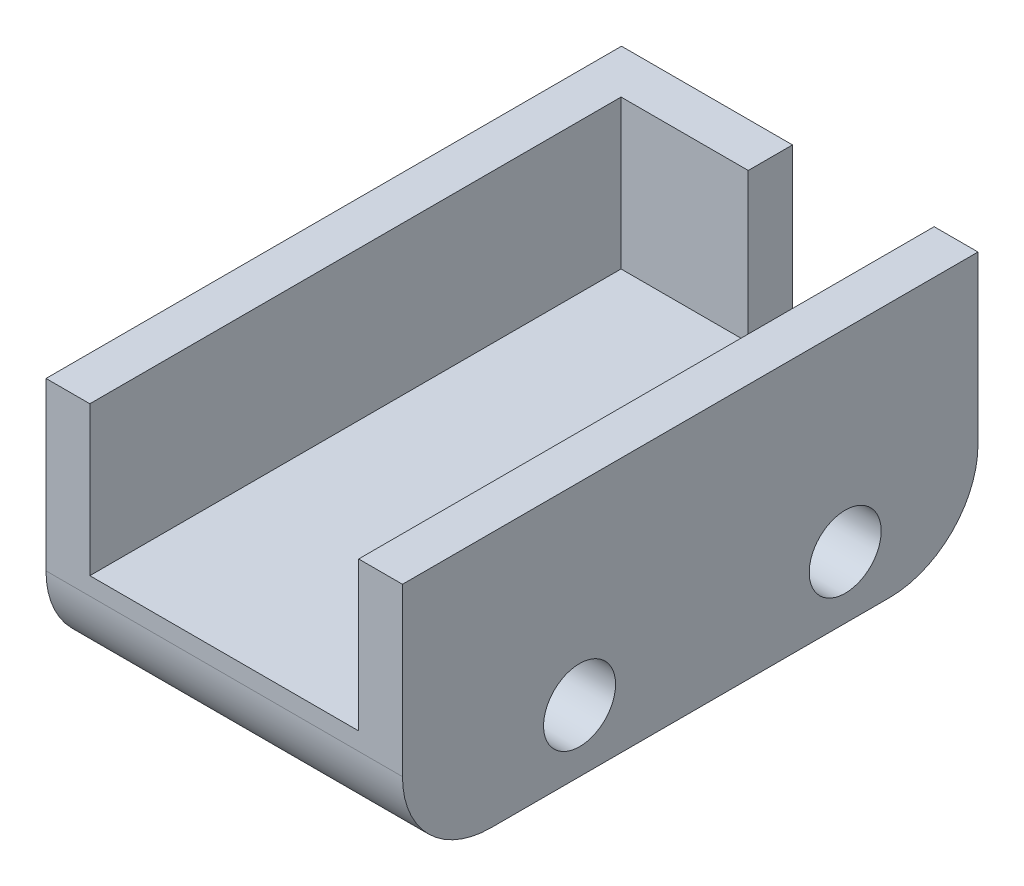
ISO-10303-21;
HEADER;
FILE_DESCRIPTION(('STEP AP214'),'2;1');
FILE_NAME('part.step','',(''),(''),'','','');
FILE_SCHEMA(('AUTOMOTIVE_DESIGN { 1 0 10303 214 1 1 1 1 }'));
ENDSEC;
DATA;
#1=APPLICATION_CONTEXT('core data for automotive mechanical design processes');
#2=APPLICATION_PROTOCOL_DEFINITION('international standard','automotive_design',2000,#1);
#3=PRODUCT_CONTEXT('',#1,'mechanical');
#4=PRODUCT('Part','Part','',(#3));
#5=PRODUCT_RELATED_PRODUCT_CATEGORY('part','',(#4));
#6=PRODUCT_DEFINITION_FORMATION('','',#4);
#7=PRODUCT_DEFINITION_CONTEXT('part definition',#1,'design');
#8=PRODUCT_DEFINITION('design','',#6,#7);
#9=PRODUCT_DEFINITION_SHAPE('','',#8);
#10=(LENGTH_UNIT() NAMED_UNIT(*) SI_UNIT(.MILLI.,.METRE.));
#11=(NAMED_UNIT(*) PLANE_ANGLE_UNIT() SI_UNIT($,.RADIAN.));
#12=(NAMED_UNIT(*) SI_UNIT($,.STERADIAN.) SOLID_ANGLE_UNIT());
#13=UNCERTAINTY_MEASURE_WITH_UNIT(LENGTH_MEASURE(1.E-05),#10,'distance_accuracy_value','');
#14=(GEOMETRIC_REPRESENTATION_CONTEXT(3) GLOBAL_UNCERTAINTY_ASSIGNED_CONTEXT((#13)) GLOBAL_UNIT_ASSIGNED_CONTEXT((#10,
#11,#12)) REPRESENTATION_CONTEXT('',''));
#15=CARTESIAN_POINT('',(0.,0.,0.));
#16=DIRECTION('',(0.,0.,1.));
#17=DIRECTION('',(1.,0.,0.));
#18=AXIS2_PLACEMENT_3D('',#15,#16,#17);
#19=CARTESIAN_POINT('',(0.,26.8179352455805,65.));
#20=DIRECTION('',(0.,1.,0.));
#21=DIRECTION('',(0.,0.,1.));
#22=AXIS2_PLACEMENT_3D('',#19,#20,#21);
#23=PLANE('',#22);
#24=DIRECTION('',(1.,0.,0.));
#25=VECTOR('',#24,1.);
#26=CARTESIAN_POINT('',(0.,26.8179352455805,0.));
#27=LINE('',#26,#25);
#28=CARTESIAN_POINT('',(35.3129848,26.8179352455805,0.));
#29=VERTEX_POINT('',#28);
#30=CARTESIAN_POINT('',(40.2629848,26.8179352455805,0.));
#31=VERTEX_POINT('',#30);
#32=EDGE_CURVE('E149',#29,#31,#27,.T.);
#33=ORIENTED_EDGE('',*,*,#32,.F.);
#34=DIRECTION('',(0.,0.,-1.));
#35=VECTOR('',#34,1.);
#36=CARTESIAN_POINT('',(35.3129848,26.8179352455805,65.));
#37=LINE('',#36,#35);
#38=CARTESIAN_POINT('',(35.3129848,26.8179352455805,65.));
#39=VERTEX_POINT('',#38);
#40=EDGE_CURVE('E131',#39,#29,#37,.T.);
#41=ORIENTED_EDGE('',*,*,#40,.F.);
#42=DIRECTION('',(1.,0.,0.));
#43=VECTOR('',#42,1.);
#44=CARTESIAN_POINT('',(0.,26.8179352455805,65.));
#45=LINE('',#44,#43);
#46=CARTESIAN_POINT('',(40.2629848,26.8179352455805,65.));
#47=VERTEX_POINT('',#46);
#48=EDGE_CURVE('E181',#39,#47,#45,.T.);
#49=ORIENTED_EDGE('',*,*,#48,.T.);
#50=DIRECTION('',(0.,0.,-1.));
#51=VECTOR('',#50,1.);
#52=CARTESIAN_POINT('',(40.2629848,26.8179352455805,65.));
#53=LINE('',#52,#51);
#54=EDGE_CURVE('E160',#47,#31,#53,.T.);
#55=ORIENTED_EDGE('',*,*,#54,.T.);
#56=EDGE_LOOP('',(#33,#41,#49,#55));
#57=FACE_BOUND('',#56,.T.);
#58=ADVANCED_FACE('F41',(#57),#23,.T.);
#59=CARTESIAN_POINT('',(0.,8.,55.));
#60=DIRECTION('',(1.,0.,0.));
#61=DIRECTION('',(0.,0.,-1.));
#62=AXIS2_PLACEMENT_3D('',#59,#60,#61);
#63=CYLINDRICAL_SURFACE('',#62,10.);
#64=DIRECTION('',(1.,0.,0.));
#65=VECTOR('',#64,1.);
#66=CARTESIAN_POINT('',(0.,8.,65.));
#67=LINE('',#66,#65);
#68=CARTESIAN_POINT('',(0.,8.,65.));
#69=VERTEX_POINT('',#68);
#70=CARTESIAN_POINT('',(40.2629848,8.,65.));
#71=VERTEX_POINT('',#70);
#72=EDGE_CURVE('E203',#69,#71,#67,.T.);
#73=ORIENTED_EDGE('',*,*,#72,.F.);
#74=CARTESIAN_POINT('',(0.,8.,55.));
#75=DIRECTION('',(-1.,0.,0.));
#76=DIRECTION('',(0.,0.,1.));
#77=AXIS2_PLACEMENT_3D('',#74,#75,#76);
#78=CIRCLE('',#77,10.);
#79=CARTESIAN_POINT('',(0.,-2.,55.));
#80=VERTEX_POINT('',#79);
#81=EDGE_CURVE('E50',#80,#69,#78,.T.);
#82=ORIENTED_EDGE('',*,*,#81,.F.);
#83=DIRECTION('',(1.,0.,0.));
#84=VECTOR('',#83,1.);
#85=CARTESIAN_POINT('',(0.,-2.,55.));
#86=LINE('',#85,#84);
#87=CARTESIAN_POINT('',(40.2629848,-2.,55.));
#88=VERTEX_POINT('',#87);
#89=EDGE_CURVE('E207',#88,#80,#86,.F.);
#90=ORIENTED_EDGE('',*,*,#89,.F.);
#91=CARTESIAN_POINT('',(40.2629848,8.,55.));
#92=DIRECTION('',(-1.,0.,0.));
#93=DIRECTION('',(0.,-1.,0.));
#94=AXIS2_PLACEMENT_3D('',#91,#92,#93);
#95=CIRCLE('',#94,10.);
#96=EDGE_CURVE('E11',#71,#88,#95,.F.);
#97=ORIENTED_EDGE('',*,*,#96,.F.);
#98=EDGE_LOOP('',(#73,#82,#90,#97));
#99=FACE_BOUND('',#98,.T.);
#100=ADVANCED_FACE('F43',(#99),#63,.T.);
#101=CARTESIAN_POINT('',(0.,8.,10.));
#102=DIRECTION('',(1.,0.,0.));
#103=DIRECTION('',(0.,0.,-1.));
#104=AXIS2_PLACEMENT_3D('',#101,#102,#103);
#105=CYLINDRICAL_SURFACE('',#104,10.);
#106=DIRECTION('',(-1.,0.,0.));
#107=VECTOR('',#106,1.);
#108=CARTESIAN_POINT('',(0.,8.,0.));
#109=LINE('',#108,#107);
#110=CARTESIAN_POINT('',(40.2629848,8.,0.));
#111=VERTEX_POINT('',#110);
#112=CARTESIAN_POINT('',(0.,8.,0.));
#113=VERTEX_POINT('',#112);
#114=EDGE_CURVE('E186',#111,#113,#109,.T.);
#115=ORIENTED_EDGE('',*,*,#114,.F.);
#116=CARTESIAN_POINT('',(40.2629848,8.,10.));
#117=DIRECTION('',(-1.,0.,0.));
#118=DIRECTION('',(0.,-1.,0.));
#119=AXIS2_PLACEMENT_3D('',#116,#117,#118);
#120=CIRCLE('',#119,10.);
#121=CARTESIAN_POINT('',(40.2629848,-2.,9.99999999999999));
#122=VERTEX_POINT('',#121);
#123=EDGE_CURVE('E196',#122,#111,#120,.F.);
#124=ORIENTED_EDGE('',*,*,#123,.F.);
#125=DIRECTION('',(-1.,0.,0.));
#126=VECTOR('',#125,1.);
#127=CARTESIAN_POINT('',(0.,-2.,10.));
#128=LINE('',#127,#126);
#129=CARTESIAN_POINT('',(0.,-2.,9.99999999999999));
#130=VERTEX_POINT('',#129);
#131=EDGE_CURVE('E192',#130,#122,#128,.F.);
#132=ORIENTED_EDGE('',*,*,#131,.F.);
#133=CARTESIAN_POINT('',(0.,8.,10.));
#134=DIRECTION('',(-1.,0.,0.));
#135=DIRECTION('',(0.,0.,1.));
#136=AXIS2_PLACEMENT_3D('',#133,#134,#135);
#137=CIRCLE('',#136,10.);
#138=EDGE_CURVE('E199',#113,#130,#137,.T.);
#139=ORIENTED_EDGE('',*,*,#138,.F.);
#140=EDGE_LOOP('',(#115,#124,#132,#139));
#141=FACE_BOUND('',#140,.T.);
#142=ADVANCED_FACE('F307',(#141),#105,.T.);
#143=DIRECTION('',(0.,0.,1.));
#144=VECTOR('',#143,1.);
#145=CARTESIAN_POINT('',(19.3129848,26.8179352455805,0.));
#146=LINE('',#145,#144);
#147=CARTESIAN_POINT('',(19.3129848,26.8179352455805,0.));
#148=VERTEX_POINT('',#147);
#149=CARTESIAN_POINT('',(19.3129848,26.8179352455805,5.));
#150=VERTEX_POINT('',#149);
#151=EDGE_CURVE('E57',#148,#150,#146,.T.);
#152=ORIENTED_EDGE('',*,*,#151,.F.);
#153=CARTESIAN_POINT('',(0.,26.8179352455805,0.));
#154=VERTEX_POINT('',#153);
#155=EDGE_CURVE('E162',#154,#148,#27,.T.);
#156=ORIENTED_EDGE('',*,*,#155,.F.);
#157=DIRECTION('',(0.,0.,-1.));
#158=VECTOR('',#157,1.);
#159=CARTESIAN_POINT('',(0.,26.8179352455805,65.));
#160=LINE('',#159,#158);
#161=CARTESIAN_POINT('',(0.,26.8179352455805,65.));
#162=VERTEX_POINT('',#161);
#163=EDGE_CURVE('E182',#162,#154,#160,.T.);
#164=ORIENTED_EDGE('',*,*,#163,.F.);
#165=CARTESIAN_POINT('',(4.95,26.8179352455805,65.));
#166=VERTEX_POINT('',#165);
#167=EDGE_CURVE('E224',#162,#166,#45,.T.);
#168=ORIENTED_EDGE('',*,*,#167,.T.);
#169=DIRECTION('',(0.,0.,-1.));
#170=VECTOR('',#169,1.);
#171=CARTESIAN_POINT('',(4.95,26.8179352455805,65.));
#172=LINE('',#171,#170);
#173=CARTESIAN_POINT('',(4.95,26.8179352455805,5.));
#174=VERTEX_POINT('',#173);
#175=EDGE_CURVE('E163',#166,#174,#172,.T.);
#176=ORIENTED_EDGE('',*,*,#175,.T.);
#177=DIRECTION('',(1.,0.,0.));
#178=VECTOR('',#177,1.);
#179=CARTESIAN_POINT('',(0.,26.8179352455805,5.));
#180=LINE('',#179,#178);
#181=EDGE_CURVE('E231',#174,#150,#180,.T.);
#182=ORIENTED_EDGE('',*,*,#181,.T.);
#183=EDGE_LOOP('',(#152,#156,#164,#168,#176,#182));
#184=FACE_BOUND('',#183,.T.);
#185=ADVANCED_FACE('F290',(#184),#23,.T.);
#186=CARTESIAN_POINT('',(0.,0.,65.));
#187=DIRECTION('',(0.,0.,1.));
#188=DIRECTION('',(1.,0.,0.));
#189=AXIS2_PLACEMENT_3D('',#186,#187,#188);
#190=PLANE('',#189);
#191=DIRECTION('',(0.,1.,0.));
#192=VECTOR('',#191,1.);
#193=CARTESIAN_POINT('',(0.,0.,65.));
#194=LINE('',#193,#192);
#195=EDGE_CURVE('E174',#69,#162,#194,.T.);
#196=ORIENTED_EDGE('',*,*,#195,.F.);
#197=ORIENTED_EDGE('',*,*,#72,.T.);
#198=DIRECTION('',(0.,1.,0.));
#199=VECTOR('',#198,1.);
#200=CARTESIAN_POINT('',(40.2629848,0.,65.));
#201=LINE('',#200,#199);
#202=EDGE_CURVE('E226',#71,#47,#201,.T.);
#203=ORIENTED_EDGE('',*,*,#202,.T.);
#204=ORIENTED_EDGE('',*,*,#48,.F.);
#205=DIRECTION('',(0.,1.,0.));
#206=VECTOR('',#205,1.);
#207=CARTESIAN_POINT('',(35.3129848,0.,65.));
#208=LINE('',#207,#206);
#209=CARTESIAN_POINT('',(35.3129848,10.,65.));
#210=VERTEX_POINT('',#209);
#211=EDGE_CURVE('E137',#210,#39,#208,.T.);
#212=ORIENTED_EDGE('',*,*,#211,.F.);
#213=DIRECTION('',(1.,0.,0.));
#214=VECTOR('',#213,1.);
#215=CARTESIAN_POINT('',(0.,10.,65.));
#216=LINE('',#215,#214);
#217=CARTESIAN_POINT('',(4.95,10.,65.));
#218=VERTEX_POINT('',#217);
#219=EDGE_CURVE('E239',#218,#210,#216,.T.);
#220=ORIENTED_EDGE('',*,*,#219,.F.);
#221=DIRECTION('',(0.,1.,0.));
#222=VECTOR('',#221,1.);
#223=CARTESIAN_POINT('',(4.95,0.,65.));
#224=LINE('',#223,#222);
#225=EDGE_CURVE('E144',#218,#166,#224,.T.);
#226=ORIENTED_EDGE('',*,*,#225,.T.);
#227=ORIENTED_EDGE('',*,*,#167,.F.);
#228=EDGE_LOOP('',(#196,#197,#203,#204,#212,#220,#226,#227));
#229=FACE_BOUND('',#228,.T.);
#230=ADVANCED_FACE('F221',(#229),#190,.T.);
#231=CARTESIAN_POINT('',(0.,0.,65.));
#232=DIRECTION('',(-1.,0.,0.));
#233=DIRECTION('',(0.,0.,1.));
#234=AXIS2_PLACEMENT_3D('',#231,#232,#233);
#235=PLANE('',#234);
#236=CARTESIAN_POINT('',(0.,5.00000000000002,15.));
#237=DIRECTION('',(1.,0.,0.));
#238=DIRECTION('',(0.,0.,-1.));
#239=AXIS2_PLACEMENT_3D('',#236,#237,#238);
#240=CIRCLE('',#239,4.065);
#241=CARTESIAN_POINT('',(0.,5.00000000000002,10.935));
#242=VERTEX_POINT('',#241);
#243=EDGE_CURVE('E261',#242,#242,#240,.T.);
#244=ORIENTED_EDGE('',*,*,#243,.T.);
#245=EDGE_LOOP('',(#244));
#246=FACE_BOUND('',#245,.T.);
#247=CARTESIAN_POINT('',(0.,5.00000000000002,45.));
#248=DIRECTION('',(1.,0.,0.));
#249=DIRECTION('',(0.,0.,-1.));
#250=AXIS2_PLACEMENT_3D('',#247,#248,#249);
#251=CIRCLE('',#250,4.065);
#252=CARTESIAN_POINT('',(0.,5.00000000000002,40.935));
#253=VERTEX_POINT('',#252);
#254=EDGE_CURVE('E266',#253,#253,#251,.T.);
#255=ORIENTED_EDGE('',*,*,#254,.T.);
#256=EDGE_LOOP('',(#255));
#257=FACE_BOUND('',#256,.T.);
#258=DIRECTION('',(0.,0.,-1.));
#259=VECTOR('',#258,1.);
#260=CARTESIAN_POINT('',(0.,-2.,65.));
#261=LINE('',#260,#259);
#262=EDGE_CURVE('E217',#80,#130,#261,.T.);
#263=ORIENTED_EDGE('',*,*,#262,.F.);
#264=ORIENTED_EDGE('',*,*,#81,.T.);
#265=ORIENTED_EDGE('',*,*,#195,.T.);
#266=ORIENTED_EDGE('',*,*,#163,.T.);
#267=DIRECTION('',(0.,1.,0.));
#268=VECTOR('',#267,1.);
#269=CARTESIAN_POINT('',(0.,0.,0.));
#270=LINE('',#269,#268);
#271=EDGE_CURVE('E178',#113,#154,#270,.T.);
#272=ORIENTED_EDGE('',*,*,#271,.F.);
#273=ORIENTED_EDGE('',*,*,#138,.T.);
#274=EDGE_LOOP('',(#263,#264,#265,#266,#272,#273));
#275=FACE_BOUND('',#274,.T.);
#276=ADVANCED_FACE('F214',(#246,#257,#275),#235,.T.);
#277=CARTESIAN_POINT('',(40.2629848,0.,65.));
#278=DIRECTION('',(-1.,0.,0.));
#279=DIRECTION('',(0.,-1.,0.));
#280=AXIS2_PLACEMENT_3D('',#277,#278,#279);
#281=PLANE('',#280);
#282=CARTESIAN_POINT('',(40.2629848,5.00000000000002,15.));
#283=DIRECTION('',(1.,0.,0.));
#284=DIRECTION('',(0.,0.,-1.));
#285=AXIS2_PLACEMENT_3D('',#282,#283,#284);
#286=CIRCLE('',#285,4.065);
#287=CARTESIAN_POINT('',(40.2629848,5.00000000000002,10.935));
#288=VERTEX_POINT('',#287);
#289=EDGE_CURVE('E271',#288,#288,#286,.T.);
#290=ORIENTED_EDGE('',*,*,#289,.F.);
#291=EDGE_LOOP('',(#290));
#292=FACE_BOUND('',#291,.T.);
#293=CARTESIAN_POINT('',(40.2629848,5.00000000000002,45.));
#294=DIRECTION('',(1.,0.,0.));
#295=DIRECTION('',(0.,0.,-1.));
#296=AXIS2_PLACEMENT_3D('',#293,#294,#295);
#297=CIRCLE('',#296,4.065);
#298=CARTESIAN_POINT('',(40.2629848,5.00000000000002,40.935));
#299=VERTEX_POINT('',#298);
#300=EDGE_CURVE('E262',#299,#299,#297,.T.);
#301=ORIENTED_EDGE('',*,*,#300,.F.);
#302=EDGE_LOOP('',(#301));
#303=FACE_BOUND('',#302,.T.);
#304=ORIENTED_EDGE('',*,*,#202,.F.);
#305=ORIENTED_EDGE('',*,*,#96,.T.);
#306=DIRECTION('',(0.,0.,1.));
#307=VECTOR('',#306,1.);
#308=CARTESIAN_POINT('',(40.2629848,-2.,65.));
#309=LINE('',#308,#307);
#310=EDGE_CURVE('E235',#122,#88,#309,.T.);
#311=ORIENTED_EDGE('',*,*,#310,.F.);
#312=ORIENTED_EDGE('',*,*,#123,.T.);
#313=DIRECTION('',(0.,1.,0.));
#314=VECTOR('',#313,1.);
#315=CARTESIAN_POINT('',(40.2629848,0.,0.));
#316=LINE('',#315,#314);
#317=EDGE_CURVE('E168',#111,#31,#316,.T.);
#318=ORIENTED_EDGE('',*,*,#317,.T.);
#319=ORIENTED_EDGE('',*,*,#54,.F.);
#320=EDGE_LOOP('',(#304,#305,#311,#312,#318,#319));
#321=FACE_BOUND('',#320,.T.);
#322=ADVANCED_FACE('F302',(#292,#303,#321),#281,.F.);
#323=CARTESIAN_POINT('',(0.,0.,0.));
#324=DIRECTION('',(0.,0.,1.));
#325=DIRECTION('',(1.,0.,0.));
#326=AXIS2_PLACEMENT_3D('',#323,#324,#325);
#327=PLANE('',#326);
#328=DIRECTION('',(1.,0.,0.));
#329=VECTOR('',#328,1.);
#330=CARTESIAN_POINT('',(35.3129848,10.,0.));
#331=LINE('',#330,#329);
#332=CARTESIAN_POINT('',(19.3129848,10.,0.));
#333=VERTEX_POINT('',#332);
#334=CARTESIAN_POINT('',(35.3129848,10.,0.));
#335=VERTEX_POINT('',#334);
#336=EDGE_CURVE('E153',#333,#335,#331,.T.);
#337=ORIENTED_EDGE('',*,*,#336,.T.);
#338=DIRECTION('',(0.,1.,0.));
#339=VECTOR('',#338,1.);
#340=CARTESIAN_POINT('',(35.3129848,26.8179352455805,0.));
#341=LINE('',#340,#339);
#342=EDGE_CURVE('E134',#335,#29,#341,.T.);
#343=ORIENTED_EDGE('',*,*,#342,.T.);
#344=ORIENTED_EDGE('',*,*,#32,.T.);
#345=ORIENTED_EDGE('',*,*,#317,.F.);
#346=ORIENTED_EDGE('',*,*,#114,.T.);
#347=ORIENTED_EDGE('',*,*,#271,.T.);
#348=ORIENTED_EDGE('',*,*,#155,.T.);
#349=DIRECTION('',(0.,-1.,0.));
#350=VECTOR('',#349,1.);
#351=CARTESIAN_POINT('',(19.3129848,26.8179352455805,0.));
#352=LINE('',#351,#350);
#353=EDGE_CURVE('E155',#148,#333,#352,.T.);
#354=ORIENTED_EDGE('',*,*,#353,.T.);
#355=EDGE_LOOP('',(#337,#343,#344,#345,#346,#347,#348,#354));
#356=FACE_BOUND('',#355,.T.);
#357=ADVANCED_FACE('F147',(#356),#327,.F.);
#358=CARTESIAN_POINT('',(4.95,0.,65.));
#359=DIRECTION('',(-1.,0.,0.));
#360=DIRECTION('',(0.,0.,1.));
#361=AXIS2_PLACEMENT_3D('',#358,#359,#360);
#362=PLANE('',#361);
#363=DIRECTION('',(0.,1.,0.));
#364=VECTOR('',#363,1.);
#365=CARTESIAN_POINT('',(4.95,0.,5.));
#366=LINE('',#365,#364);
#367=CARTESIAN_POINT('',(4.95,10.,5.));
#368=VERTEX_POINT('',#367);
#369=EDGE_CURVE('E240',#368,#174,#366,.T.);
#370=ORIENTED_EDGE('',*,*,#369,.T.);
#371=ORIENTED_EDGE('',*,*,#175,.F.);
#372=ORIENTED_EDGE('',*,*,#225,.F.);
#373=DIRECTION('',(0.,0.,-1.));
#374=VECTOR('',#373,1.);
#375=CARTESIAN_POINT('',(4.95,10.,65.));
#376=LINE('',#375,#374);
#377=EDGE_CURVE('E170',#218,#368,#376,.T.);
#378=ORIENTED_EDGE('',*,*,#377,.T.);
#379=EDGE_LOOP('',(#370,#371,#372,#378));
#380=FACE_BOUND('',#379,.T.);
#381=ADVANCED_FACE('F295',(#380),#362,.F.);
#382=CARTESIAN_POINT('',(0.,10.,65.));
#383=DIRECTION('',(0.,1.,0.));
#384=DIRECTION('',(0.,0.,1.));
#385=AXIS2_PLACEMENT_3D('',#382,#383,#384);
#386=PLANE('',#385);
#387=DIRECTION('',(1.,0.,0.));
#388=VECTOR('',#387,1.);
#389=CARTESIAN_POINT('',(0.,10.,5.));
#390=LINE('',#389,#388);
#391=CARTESIAN_POINT('',(19.3129848,10.,5.));
#392=VERTEX_POINT('',#391);
#393=EDGE_CURVE('E234',#368,#392,#390,.T.);
#394=ORIENTED_EDGE('',*,*,#393,.F.);
#395=ORIENTED_EDGE('',*,*,#377,.F.);
#396=ORIENTED_EDGE('',*,*,#219,.T.);
#397=DIRECTION('',(0.,0.,-1.));
#398=VECTOR('',#397,1.);
#399=CARTESIAN_POINT('',(35.3129848,10.,65.));
#400=LINE('',#399,#398);
#401=EDGE_CURVE('E143',#210,#335,#400,.T.);
#402=ORIENTED_EDGE('',*,*,#401,.T.);
#403=ORIENTED_EDGE('',*,*,#336,.F.);
#404=DIRECTION('',(0.,0.,1.));
#405=VECTOR('',#404,1.);
#406=CARTESIAN_POINT('',(19.3129848,10.,0.));
#407=LINE('',#406,#405);
#408=EDGE_CURVE('E267',#333,#392,#407,.T.);
#409=ORIENTED_EDGE('',*,*,#408,.T.);
#410=EDGE_LOOP('',(#394,#395,#396,#402,#403,#409));
#411=FACE_BOUND('',#410,.T.);
#412=ADVANCED_FACE('F300',(#411),#386,.T.);
#413=CARTESIAN_POINT('',(35.3129848,0.,65.));
#414=DIRECTION('',(-1.,0.,0.));
#415=DIRECTION('',(0.,-1.,0.));
#416=AXIS2_PLACEMENT_3D('',#413,#414,#415);
#417=PLANE('',#416);
#418=ORIENTED_EDGE('',*,*,#40,.T.);
#419=ORIENTED_EDGE('',*,*,#342,.F.);
#420=ORIENTED_EDGE('',*,*,#401,.F.);
#421=ORIENTED_EDGE('',*,*,#211,.T.);
#422=EDGE_LOOP('',(#418,#419,#420,#421));
#423=FACE_BOUND('',#422,.T.);
#424=ADVANCED_FACE('F133',(#423),#417,.T.);
#425=CARTESIAN_POINT('',(0.,0.,5.));
#426=DIRECTION('',(0.,0.,1.));
#427=DIRECTION('',(1.,0.,0.));
#428=AXIS2_PLACEMENT_3D('',#425,#426,#427);
#429=PLANE('',#428);
#430=DIRECTION('',(0.,-1.,0.));
#431=VECTOR('',#430,1.);
#432=CARTESIAN_POINT('',(19.3129848,26.8179352455805,5.));
#433=LINE('',#432,#431);
#434=EDGE_CURVE('E156',#150,#392,#433,.T.);
#435=ORIENTED_EDGE('',*,*,#434,.F.);
#436=ORIENTED_EDGE('',*,*,#181,.F.);
#437=ORIENTED_EDGE('',*,*,#369,.F.);
#438=ORIENTED_EDGE('',*,*,#393,.T.);
#439=EDGE_LOOP('',(#435,#436,#437,#438));
#440=FACE_BOUND('',#439,.T.);
#441=ADVANCED_FACE('F293',(#440),#429,.T.);
#442=CARTESIAN_POINT('',(0.,-2.,0.));
#443=DIRECTION('',(0.,-1.,0.));
#444=DIRECTION('',(0.,0.,-1.));
#445=AXIS2_PLACEMENT_3D('',#442,#443,#444);
#446=PLANE('',#445);
#447=ORIENTED_EDGE('',*,*,#310,.T.);
#448=ORIENTED_EDGE('',*,*,#89,.T.);
#449=ORIENTED_EDGE('',*,*,#262,.T.);
#450=ORIENTED_EDGE('',*,*,#131,.T.);
#451=EDGE_LOOP('',(#447,#448,#449,#450));
#452=FACE_BOUND('',#451,.T.);
#453=ADVANCED_FACE('F309',(#452),#446,.T.);
#454=CARTESIAN_POINT('',(0.,5.00000000000002,45.));
#455=DIRECTION('',(1.,0.,0.));
#456=DIRECTION('',(0.,0.,-1.));
#457=AXIS2_PLACEMENT_3D('',#454,#455,#456);
#458=CYLINDRICAL_SURFACE('',#457,4.065);
#459=ORIENTED_EDGE('',*,*,#254,.F.);
#460=EDGE_LOOP('',(#459));
#461=FACE_BOUND('',#460,.T.);
#462=ORIENTED_EDGE('',*,*,#300,.T.);
#463=EDGE_LOOP('',(#462));
#464=FACE_BOUND('',#463,.T.);
#465=ADVANCED_FACE('F311',(#461,#464),#458,.F.);
#466=CARTESIAN_POINT('',(0.,5.00000000000002,15.));
#467=DIRECTION('',(1.,0.,0.));
#468=DIRECTION('',(0.,0.,-1.));
#469=AXIS2_PLACEMENT_3D('',#466,#467,#468);
#470=CYLINDRICAL_SURFACE('',#469,4.065);
#471=ORIENTED_EDGE('',*,*,#243,.F.);
#472=EDGE_LOOP('',(#471));
#473=FACE_BOUND('',#472,.T.);
#474=ORIENTED_EDGE('',*,*,#289,.T.);
#475=EDGE_LOOP('',(#474));
#476=FACE_BOUND('',#475,.T.);
#477=ADVANCED_FACE('F317',(#473,#476),#470,.F.);
#478=CARTESIAN_POINT('',(19.3129848,26.8179352455805,0.));
#479=DIRECTION('',(-1.,0.,0.));
#480=DIRECTION('',(0.,-1.,0.));
#481=AXIS2_PLACEMENT_3D('',#478,#479,#480);
#482=PLANE('',#481);
#483=ORIENTED_EDGE('',*,*,#434,.T.);
#484=ORIENTED_EDGE('',*,*,#408,.F.);
#485=ORIENTED_EDGE('',*,*,#353,.F.);
#486=ORIENTED_EDGE('',*,*,#151,.T.);
#487=EDGE_LOOP('',(#483,#484,#485,#486));
#488=FACE_BOUND('',#487,.T.);
#489=ADVANCED_FACE('F288',(#488),#482,.F.);
#490=CLOSED_SHELL('',(#58,#100,#142,#185,#230,#276,#322,#357,#381,#412,#424,#441,#453,#465,#477,#489));
#491=MANIFOLD_SOLID_BREP('B2',#490);
#492=ADVANCED_BREP_SHAPE_REPRESENTATION('',(#18,#491),#14);
#493=SHAPE_DEFINITION_REPRESENTATION(#9,#492);
ENDSEC;
END-ISO-10303-21;
